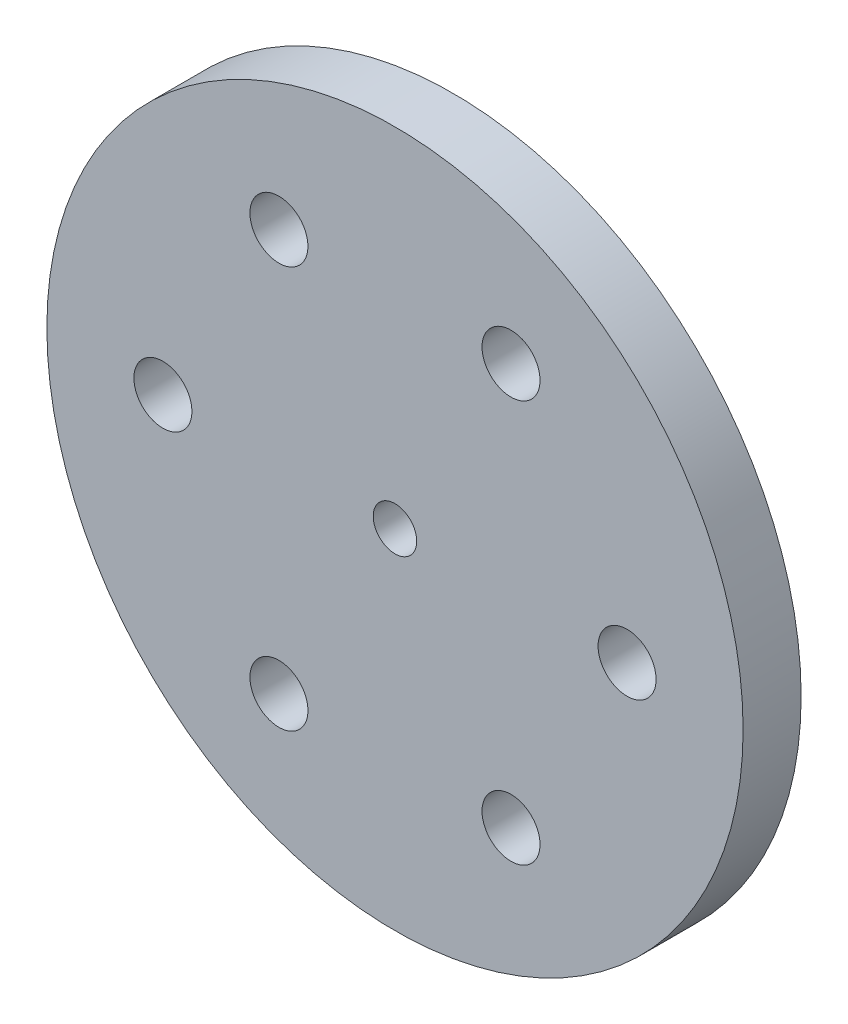
ISO-10303-21;
HEADER;
FILE_DESCRIPTION(('STEP AP214'),'2;1');
FILE_NAME('part.step','',(''),(''),'','','');
FILE_SCHEMA(('AUTOMOTIVE_DESIGN { 1 0 10303 214 1 1 1 1 }'));
ENDSEC;
DATA;
#1=APPLICATION_CONTEXT('core data for automotive mechanical design processes');
#2=APPLICATION_PROTOCOL_DEFINITION('international standard','automotive_design',2000,#1);
#3=PRODUCT_CONTEXT('',#1,'mechanical');
#4=PRODUCT('Part','Part','',(#3));
#5=PRODUCT_RELATED_PRODUCT_CATEGORY('part','',(#4));
#6=PRODUCT_DEFINITION_FORMATION('','',#4);
#7=PRODUCT_DEFINITION_CONTEXT('part definition',#1,'design');
#8=PRODUCT_DEFINITION('design','',#6,#7);
#9=PRODUCT_DEFINITION_SHAPE('','',#8);
#10=(LENGTH_UNIT() NAMED_UNIT(*) SI_UNIT(.MILLI.,.METRE.));
#11=(NAMED_UNIT(*) PLANE_ANGLE_UNIT() SI_UNIT($,.RADIAN.));
#12=(NAMED_UNIT(*) SI_UNIT($,.STERADIAN.) SOLID_ANGLE_UNIT());
#13=UNCERTAINTY_MEASURE_WITH_UNIT(LENGTH_MEASURE(1.E-05),#10,'distance_accuracy_value','');
#14=(GEOMETRIC_REPRESENTATION_CONTEXT(3) GLOBAL_UNCERTAINTY_ASSIGNED_CONTEXT((#13)) GLOBAL_UNIT_ASSIGNED_CONTEXT((#10,
#11,#12)) REPRESENTATION_CONTEXT('',''));
#15=CARTESIAN_POINT('',(0.,0.,0.));
#16=DIRECTION('',(0.,0.,1.));
#17=DIRECTION('',(1.,0.,0.));
#18=AXIS2_PLACEMENT_3D('',#15,#16,#17);
#19=CARTESIAN_POINT('',(0.,0.,6.35));
#20=DIRECTION('',(0.,0.,-1.));
#21=DIRECTION('',(-1.,0.,0.));
#22=AXIS2_PLACEMENT_3D('',#19,#20,#21);
#23=CYLINDRICAL_SURFACE('',#22,38.1);
#24=CARTESIAN_POINT('',(0.,0.,6.35));
#25=DIRECTION('',(0.,0.,1.));
#26=DIRECTION('',(1.,0.,0.));
#27=AXIS2_PLACEMENT_3D('',#24,#25,#26);
#28=CIRCLE('',#27,38.1);
#29=CARTESIAN_POINT('',(38.1,0.,6.35));
#30=VERTEX_POINT('',#29);
#31=EDGE_CURVE('E10',#30,#30,#28,.T.);
#32=ORIENTED_EDGE('',*,*,#31,.F.);
#33=EDGE_LOOP('',(#32));
#34=FACE_BOUND('',#33,.T.);
#35=CARTESIAN_POINT('',(0.,0.,0.));
#36=DIRECTION('',(0.,0.,1.));
#37=DIRECTION('',(1.,0.,0.));
#38=AXIS2_PLACEMENT_3D('',#35,#36,#37);
#39=CIRCLE('',#38,38.1);
#40=CARTESIAN_POINT('',(38.1,0.,0.));
#41=VERTEX_POINT('',#40);
#42=EDGE_CURVE('E40',#41,#41,#39,.T.);
#43=ORIENTED_EDGE('',*,*,#42,.T.);
#44=EDGE_LOOP('',(#43));
#45=FACE_BOUND('',#44,.T.);
#46=ADVANCED_FACE('F37',(#34,#45),#23,.T.);
#47=CARTESIAN_POINT('',(0.,0.,6.35));
#48=DIRECTION('',(0.,0.,1.));
#49=DIRECTION('',(1.,0.,0.));
#50=AXIS2_PLACEMENT_3D('',#47,#48,#49);
#51=PLANE('',#50);
#52=CARTESIAN_POINT('',(0.,0.,6.35));
#53=DIRECTION('',(0.,0.,1.));
#54=DIRECTION('',(1.,0.,0.));
#55=AXIS2_PLACEMENT_3D('',#52,#53,#54);
#56=CIRCLE('',#55,2.38125);
#57=CARTESIAN_POINT('',(2.38125,0.,6.35));
#58=VERTEX_POINT('',#57);
#59=EDGE_CURVE('E85',#58,#58,#56,.T.);
#60=ORIENTED_EDGE('',*,*,#59,.F.);
#61=EDGE_LOOP('',(#60));
#62=FACE_BOUND('',#61,.T.);
#63=CARTESIAN_POINT('',(25.4,0.,6.35));
#64=DIRECTION('',(0.,0.,-1.));
#65=DIRECTION('',(-1.,0.,0.));
#66=AXIS2_PLACEMENT_3D('',#63,#64,#65);
#67=CIRCLE('',#66,3.175);
#68=CARTESIAN_POINT('',(22.225,0.,6.35));
#69=VERTEX_POINT('',#68);
#70=EDGE_CURVE('E47',#69,#69,#67,.T.);
#71=ORIENTED_EDGE('',*,*,#70,.T.);
#72=EDGE_LOOP('',(#71));
#73=FACE_BOUND('',#72,.T.);
#74=CARTESIAN_POINT('',(12.7000000000003,-21.9970452561246,6.35));
#75=DIRECTION('',(0.,0.,-1.));
#76=DIRECTION('',(-1.,0.,0.));
#77=AXIS2_PLACEMENT_3D('',#74,#75,#76);
#78=CIRCLE('',#77,3.175);
#79=CARTESIAN_POINT('',(9.52500000000026,-21.9970452561246,6.35));
#80=VERTEX_POINT('',#79);
#81=EDGE_CURVE('E75',#80,#80,#78,.T.);
#82=ORIENTED_EDGE('',*,*,#81,.T.);
#83=EDGE_LOOP('',(#82));
#84=FACE_BOUND('',#83,.T.);
#85=CARTESIAN_POINT('',(-12.6999999999998,-21.9970452561249,6.35));
#86=DIRECTION('',(0.,0.,-1.));
#87=DIRECTION('',(-1.,0.,0.));
#88=AXIS2_PLACEMENT_3D('',#85,#86,#87);
#89=CIRCLE('',#88,3.175);
#90=CARTESIAN_POINT('',(-15.8749999999998,-21.9970452561249,6.35));
#91=VERTEX_POINT('',#90);
#92=EDGE_CURVE('E49',#91,#91,#89,.T.);
#93=ORIENTED_EDGE('',*,*,#92,.T.);
#94=EDGE_LOOP('',(#93));
#95=FACE_BOUND('',#94,.T.);
#96=CARTESIAN_POINT('',(-25.4,-1.77367252013231E-13,6.35));
#97=DIRECTION('',(0.,0.,-1.));
#98=DIRECTION('',(-1.,0.,0.));
#99=AXIS2_PLACEMENT_3D('',#96,#97,#98);
#100=CIRCLE('',#99,3.175);
#101=CARTESIAN_POINT('',(-28.575,-1.77367252013231E-13,6.35));
#102=VERTEX_POINT('',#101);
#103=EDGE_CURVE('E56',#102,#102,#100,.T.);
#104=ORIENTED_EDGE('',*,*,#103,.T.);
#105=EDGE_LOOP('',(#104));
#106=FACE_BOUND('',#105,.T.);
#107=CARTESIAN_POINT('',(-12.7000000000001,21.9970452561247,6.35));
#108=DIRECTION('',(0.,0.,-1.));
#109=DIRECTION('',(-1.,0.,0.));
#110=AXIS2_PLACEMENT_3D('',#107,#108,#109);
#111=CIRCLE('',#110,3.17500000000001);
#112=CARTESIAN_POINT('',(-15.8750000000001,21.9970452561247,6.35));
#113=VERTEX_POINT('',#112);
#114=EDGE_CURVE('E62',#113,#113,#111,.T.);
#115=ORIENTED_EDGE('',*,*,#114,.T.);
#116=EDGE_LOOP('',(#115));
#117=FACE_BOUND('',#116,.T.);
#118=CARTESIAN_POINT('',(12.6999999999999,21.9970452561248,6.35));
#119=DIRECTION('',(0.,0.,-1.));
#120=DIRECTION('',(-1.,0.,0.));
#121=AXIS2_PLACEMENT_3D('',#118,#119,#120);
#122=CIRCLE('',#121,3.175);
#123=CARTESIAN_POINT('',(9.52499999999995,21.9970452561248,6.35));
#124=VERTEX_POINT('',#123);
#125=EDGE_CURVE('E68',#124,#124,#122,.T.);
#126=ORIENTED_EDGE('',*,*,#125,.T.);
#127=EDGE_LOOP('',(#126));
#128=FACE_BOUND('',#127,.T.);
#129=ORIENTED_EDGE('',*,*,#31,.T.);
#130=EDGE_LOOP('',(#129));
#131=FACE_BOUND('',#130,.T.);
#132=ADVANCED_FACE('F101',(#62,#73,#84,#95,#106,#117,#128,#131),#51,.T.);
#133=CARTESIAN_POINT('',(0.,0.,0.));
#134=DIRECTION('',(0.,0.,1.));
#135=DIRECTION('',(1.,0.,0.));
#136=AXIS2_PLACEMENT_3D('',#133,#134,#135);
#137=PLANE('',#136);
#138=CARTESIAN_POINT('',(0.,0.,0.));
#139=DIRECTION('',(0.,0.,1.));
#140=DIRECTION('',(1.,0.,0.));
#141=AXIS2_PLACEMENT_3D('',#138,#139,#140);
#142=CIRCLE('',#141,2.38125);
#143=CARTESIAN_POINT('',(2.38125,0.,0.));
#144=VERTEX_POINT('',#143);
#145=EDGE_CURVE('E78',#144,#144,#142,.T.);
#146=ORIENTED_EDGE('',*,*,#145,.T.);
#147=EDGE_LOOP('',(#146));
#148=FACE_BOUND('',#147,.T.);
#149=CARTESIAN_POINT('',(25.4,0.,0.));
#150=DIRECTION('',(0.,0.,-1.));
#151=DIRECTION('',(-1.,0.,0.));
#152=AXIS2_PLACEMENT_3D('',#149,#150,#151);
#153=CIRCLE('',#152,3.175);
#154=CARTESIAN_POINT('',(22.225,0.,0.));
#155=VERTEX_POINT('',#154);
#156=EDGE_CURVE('E74',#155,#155,#153,.T.);
#157=ORIENTED_EDGE('',*,*,#156,.F.);
#158=EDGE_LOOP('',(#157));
#159=FACE_BOUND('',#158,.T.);
#160=CARTESIAN_POINT('',(12.7000000000003,-21.9970452561246,0.));
#161=DIRECTION('',(0.,0.,-1.));
#162=DIRECTION('',(-1.,0.,0.));
#163=AXIS2_PLACEMENT_3D('',#160,#161,#162);
#164=CIRCLE('',#163,3.175);
#165=CARTESIAN_POINT('',(9.52500000000026,-21.9970452561246,0.));
#166=VERTEX_POINT('',#165);
#167=EDGE_CURVE('E53',#166,#166,#164,.T.);
#168=ORIENTED_EDGE('',*,*,#167,.F.);
#169=EDGE_LOOP('',(#168));
#170=FACE_BOUND('',#169,.T.);
#171=CARTESIAN_POINT('',(-12.6999999999998,-21.9970452561249,0.));
#172=DIRECTION('',(0.,0.,-1.));
#173=DIRECTION('',(-1.,0.,0.));
#174=AXIS2_PLACEMENT_3D('',#171,#172,#173);
#175=CIRCLE('',#174,3.175);
#176=CARTESIAN_POINT('',(-15.8749999999998,-21.9970452561249,0.));
#177=VERTEX_POINT('',#176);
#178=EDGE_CURVE('E52',#177,#177,#175,.T.);
#179=ORIENTED_EDGE('',*,*,#178,.F.);
#180=EDGE_LOOP('',(#179));
#181=FACE_BOUND('',#180,.T.);
#182=CARTESIAN_POINT('',(-25.4,-1.77367252013231E-13,0.));
#183=DIRECTION('',(0.,0.,-1.));
#184=DIRECTION('',(-1.,0.,0.));
#185=AXIS2_PLACEMENT_3D('',#182,#183,#184);
#186=CIRCLE('',#185,3.175);
#187=CARTESIAN_POINT('',(-28.575,-1.77367252013231E-13,0.));
#188=VERTEX_POINT('',#187);
#189=EDGE_CURVE('E59',#188,#188,#186,.T.);
#190=ORIENTED_EDGE('',*,*,#189,.F.);
#191=EDGE_LOOP('',(#190));
#192=FACE_BOUND('',#191,.T.);
#193=CARTESIAN_POINT('',(-12.7000000000001,21.9970452561247,0.));
#194=DIRECTION('',(0.,0.,-1.));
#195=DIRECTION('',(-1.,0.,0.));
#196=AXIS2_PLACEMENT_3D('',#193,#194,#195);
#197=CIRCLE('',#196,3.17500000000001);
#198=CARTESIAN_POINT('',(-15.8750000000001,21.9970452561247,0.));
#199=VERTEX_POINT('',#198);
#200=EDGE_CURVE('E65',#199,#199,#197,.T.);
#201=ORIENTED_EDGE('',*,*,#200,.F.);
#202=EDGE_LOOP('',(#201));
#203=FACE_BOUND('',#202,.T.);
#204=CARTESIAN_POINT('',(12.6999999999999,21.9970452561248,0.));
#205=DIRECTION('',(0.,0.,-1.));
#206=DIRECTION('',(-1.,0.,0.));
#207=AXIS2_PLACEMENT_3D('',#204,#205,#206);
#208=CIRCLE('',#207,3.175);
#209=CARTESIAN_POINT('',(9.52499999999995,21.9970452561248,0.));
#210=VERTEX_POINT('',#209);
#211=EDGE_CURVE('E71',#210,#210,#208,.T.);
#212=ORIENTED_EDGE('',*,*,#211,.F.);
#213=EDGE_LOOP('',(#212));
#214=FACE_BOUND('',#213,.T.);
#215=ORIENTED_EDGE('',*,*,#42,.F.);
#216=EDGE_LOOP('',(#215));
#217=FACE_BOUND('',#216,.T.);
#218=ADVANCED_FACE('F91',(#148,#159,#170,#181,#192,#203,#214,#217),#137,.F.);
#219=CARTESIAN_POINT('',(12.6999999999999,21.9970452561248,6.35));
#220=DIRECTION('',(0.,0.,-1.));
#221=DIRECTION('',(-1.,0.,0.));
#222=AXIS2_PLACEMENT_3D('',#219,#220,#221);
#223=CYLINDRICAL_SURFACE('',#222,3.175);
#224=ORIENTED_EDGE('',*,*,#125,.F.);
#225=EDGE_LOOP('',(#224));
#226=FACE_BOUND('',#225,.T.);
#227=ORIENTED_EDGE('',*,*,#211,.T.);
#228=EDGE_LOOP('',(#227));
#229=FACE_BOUND('',#228,.T.);
#230=ADVANCED_FACE('F117',(#226,#229),#223,.F.);
#231=CARTESIAN_POINT('',(-12.7000000000001,21.9970452561247,6.35));
#232=DIRECTION('',(0.,0.,-1.));
#233=DIRECTION('',(-1.,0.,0.));
#234=AXIS2_PLACEMENT_3D('',#231,#232,#233);
#235=CYLINDRICAL_SURFACE('',#234,3.17500000000001);
#236=ORIENTED_EDGE('',*,*,#114,.F.);
#237=EDGE_LOOP('',(#236));
#238=FACE_BOUND('',#237,.T.);
#239=ORIENTED_EDGE('',*,*,#200,.T.);
#240=EDGE_LOOP('',(#239));
#241=FACE_BOUND('',#240,.T.);
#242=ADVANCED_FACE('F120',(#238,#241),#235,.F.);
#243=CARTESIAN_POINT('',(-25.4,-1.77367252013231E-13,6.35));
#244=DIRECTION('',(0.,0.,-1.));
#245=DIRECTION('',(-1.,0.,0.));
#246=AXIS2_PLACEMENT_3D('',#243,#244,#245);
#247=CYLINDRICAL_SURFACE('',#246,3.175);
#248=ORIENTED_EDGE('',*,*,#103,.F.);
#249=EDGE_LOOP('',(#248));
#250=FACE_BOUND('',#249,.T.);
#251=ORIENTED_EDGE('',*,*,#189,.T.);
#252=EDGE_LOOP('',(#251));
#253=FACE_BOUND('',#252,.T.);
#254=ADVANCED_FACE('F146',(#250,#253),#247,.F.);
#255=CARTESIAN_POINT('',(-12.6999999999998,-21.9970452561249,6.35));
#256=DIRECTION('',(0.,0.,-1.));
#257=DIRECTION('',(-1.,0.,0.));
#258=AXIS2_PLACEMENT_3D('',#255,#256,#257);
#259=CYLINDRICAL_SURFACE('',#258,3.175);
#260=ORIENTED_EDGE('',*,*,#92,.F.);
#261=EDGE_LOOP('',(#260));
#262=FACE_BOUND('',#261,.T.);
#263=ORIENTED_EDGE('',*,*,#178,.T.);
#264=EDGE_LOOP('',(#263));
#265=FACE_BOUND('',#264,.T.);
#266=ADVANCED_FACE('F155',(#262,#265),#259,.F.);
#267=CARTESIAN_POINT('',(12.7000000000003,-21.9970452561246,6.35));
#268=DIRECTION('',(0.,0.,-1.));
#269=DIRECTION('',(-1.,0.,0.));
#270=AXIS2_PLACEMENT_3D('',#267,#268,#269);
#271=CYLINDRICAL_SURFACE('',#270,3.175);
#272=ORIENTED_EDGE('',*,*,#81,.F.);
#273=EDGE_LOOP('',(#272));
#274=FACE_BOUND('',#273,.T.);
#275=ORIENTED_EDGE('',*,*,#167,.T.);
#276=EDGE_LOOP('',(#275));
#277=FACE_BOUND('',#276,.T.);
#278=ADVANCED_FACE('F164',(#274,#277),#271,.F.);
#279=CARTESIAN_POINT('',(25.4,0.,6.35));
#280=DIRECTION('',(0.,0.,-1.));
#281=DIRECTION('',(-1.,0.,0.));
#282=AXIS2_PLACEMENT_3D('',#279,#280,#281);
#283=CYLINDRICAL_SURFACE('',#282,3.175);
#284=ORIENTED_EDGE('',*,*,#70,.F.);
#285=EDGE_LOOP('',(#284));
#286=FACE_BOUND('',#285,.T.);
#287=ORIENTED_EDGE('',*,*,#156,.T.);
#288=EDGE_LOOP('',(#287));
#289=FACE_BOUND('',#288,.T.);
#290=ADVANCED_FACE('F97',(#286,#289),#283,.F.);
#291=CARTESIAN_POINT('',(0.,0.,0.));
#292=DIRECTION('',(0.,0.,1.));
#293=DIRECTION('',(1.,0.,0.));
#294=AXIS2_PLACEMENT_3D('',#291,#292,#293);
#295=CYLINDRICAL_SURFACE('',#294,2.38125);
#296=ORIENTED_EDGE('',*,*,#145,.F.);
#297=EDGE_LOOP('',(#296));
#298=FACE_BOUND('',#297,.T.);
#299=ORIENTED_EDGE('',*,*,#59,.T.);
#300=EDGE_LOOP('',(#299));
#301=FACE_BOUND('',#300,.T.);
#302=ADVANCED_FACE('F94',(#298,#301),#295,.F.);
#303=CLOSED_SHELL('',(#46,#132,#218,#230,#242,#254,#266,#278,#290,#302));
#304=MANIFOLD_SOLID_BREP('B2',#303);
#305=ADVANCED_BREP_SHAPE_REPRESENTATION('',(#18,#304),#14);
#306=SHAPE_DEFINITION_REPRESENTATION(#9,#305);
ENDSEC;
END-ISO-10303-21;
